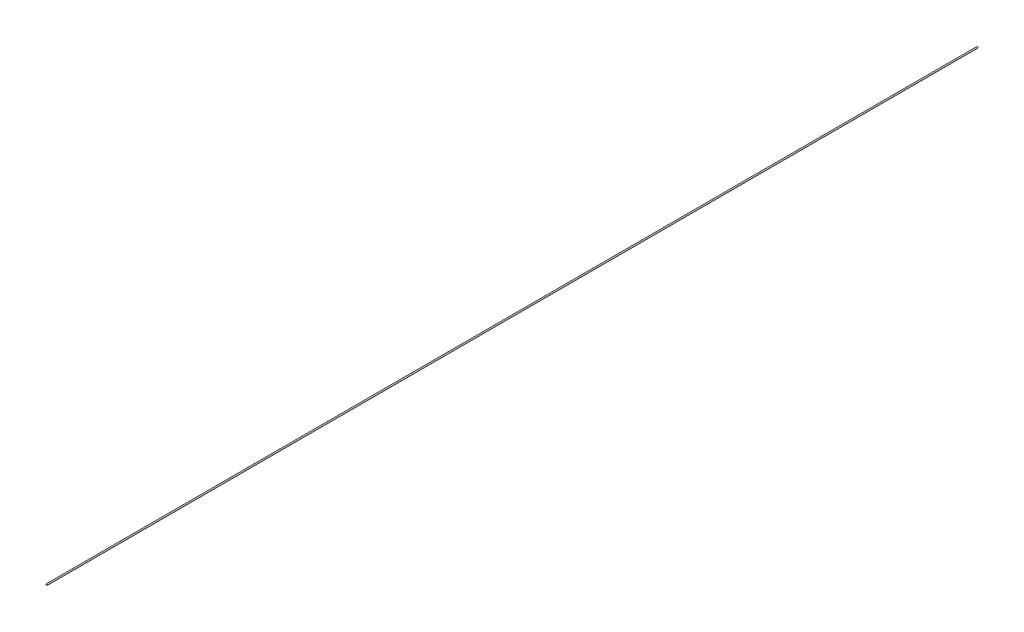
ISO-10303-21;
HEADER;
FILE_DESCRIPTION(('STEP AP214'),'2;1');
FILE_NAME('part.step','',(''),(''),'','','');
FILE_SCHEMA(('AUTOMOTIVE_DESIGN { 1 0 10303 214 1 1 1 1 }'));
ENDSEC;
DATA;
#1=APPLICATION_CONTEXT('core data for automotive mechanical design processes');
#2=APPLICATION_PROTOCOL_DEFINITION('international standard','automotive_design',2000,#1);
#3=PRODUCT_CONTEXT('',#1,'mechanical');
#4=PRODUCT('Part','Part','',(#3));
#5=PRODUCT_RELATED_PRODUCT_CATEGORY('part','',(#4));
#6=PRODUCT_DEFINITION_FORMATION('','',#4);
#7=PRODUCT_DEFINITION_CONTEXT('part definition',#1,'design');
#8=PRODUCT_DEFINITION('design','',#6,#7);
#9=PRODUCT_DEFINITION_SHAPE('','',#8);
#10=(LENGTH_UNIT() NAMED_UNIT(*) SI_UNIT(.MILLI.,.METRE.));
#11=(NAMED_UNIT(*) PLANE_ANGLE_UNIT() SI_UNIT($,.RADIAN.));
#12=(NAMED_UNIT(*) SI_UNIT($,.STERADIAN.) SOLID_ANGLE_UNIT());
#13=UNCERTAINTY_MEASURE_WITH_UNIT(LENGTH_MEASURE(1.E-05),#10,'distance_accuracy_value','');
#14=(GEOMETRIC_REPRESENTATION_CONTEXT(3) GLOBAL_UNCERTAINTY_ASSIGNED_CONTEXT((#13)) GLOBAL_UNIT_ASSIGNED_CONTEXT((#10,
#11,#12)) REPRESENTATION_CONTEXT('',''));
#15=CARTESIAN_POINT('',(0.,0.,0.));
#16=DIRECTION('',(0.,0.,1.));
#17=DIRECTION('',(1.,0.,0.));
#18=AXIS2_PLACEMENT_3D('',#15,#16,#17);
#19=CARTESIAN_POINT('',(2.72807778305821,0.,40000.));
#20=DIRECTION('',(0.,0.,-1.));
#21=DIRECTION('',(-1.,0.,0.));
#22=AXIS2_PLACEMENT_3D('',#19,#20,#21);
#23=CYLINDRICAL_SURFACE('',#22,30.);
#24=CARTESIAN_POINT('',(2.72807778305821,0.,40000.));
#25=DIRECTION('',(0.,0.,1.));
#26=DIRECTION('',(1.,0.,0.));
#27=AXIS2_PLACEMENT_3D('',#24,#25,#26);
#28=CIRCLE('',#27,30.);
#29=CARTESIAN_POINT('',(32.7280777830582,0.,40000.));
#30=VERTEX_POINT('',#29);
#31=EDGE_CURVE('E10',#30,#30,#28,.T.);
#32=ORIENTED_EDGE('',*,*,#31,.F.);
#33=EDGE_LOOP('',(#32));
#34=FACE_BOUND('',#33,.T.);
#35=CARTESIAN_POINT('',(2.72807778305821,0.,0.));
#36=DIRECTION('',(0.,0.,1.));
#37=DIRECTION('',(1.,0.,0.));
#38=AXIS2_PLACEMENT_3D('',#35,#36,#37);
#39=CIRCLE('',#38,30.);
#40=CARTESIAN_POINT('',(32.7280777830582,0.,0.));
#41=VERTEX_POINT('',#40);
#42=EDGE_CURVE('E40',#41,#41,#39,.T.);
#43=ORIENTED_EDGE('',*,*,#42,.T.);
#44=EDGE_LOOP('',(#43));
#45=FACE_BOUND('',#44,.T.);
#46=ADVANCED_FACE('F37',(#34,#45),#23,.T.);
#47=CARTESIAN_POINT('',(2.72807778305821,0.,40000.));
#48=DIRECTION('',(0.,0.,1.));
#49=DIRECTION('',(1.,0.,0.));
#50=AXIS2_PLACEMENT_3D('',#47,#48,#49);
#51=PLANE('',#50);
#52=ORIENTED_EDGE('',*,*,#31,.T.);
#53=EDGE_LOOP('',(#52));
#54=FACE_BOUND('',#53,.T.);
#55=ADVANCED_FACE('F54',(#54),#51,.T.);
#56=CARTESIAN_POINT('',(2.72807778305821,0.,0.));
#57=DIRECTION('',(0.,0.,1.));
#58=DIRECTION('',(1.,0.,0.));
#59=AXIS2_PLACEMENT_3D('',#56,#57,#58);
#60=PLANE('',#59);
#61=ORIENTED_EDGE('',*,*,#42,.F.);
#62=EDGE_LOOP('',(#61));
#63=FACE_BOUND('',#62,.T.);
#64=ADVANCED_FACE('F52',(#63),#60,.F.);
#65=CLOSED_SHELL('',(#46,#55,#64));
#66=MANIFOLD_SOLID_BREP('B2',#65);
#67=ADVANCED_BREP_SHAPE_REPRESENTATION('',(#18,#66),#14);
#68=SHAPE_DEFINITION_REPRESENTATION(#9,#67);
ENDSEC;
END-ISO-10303-21;
